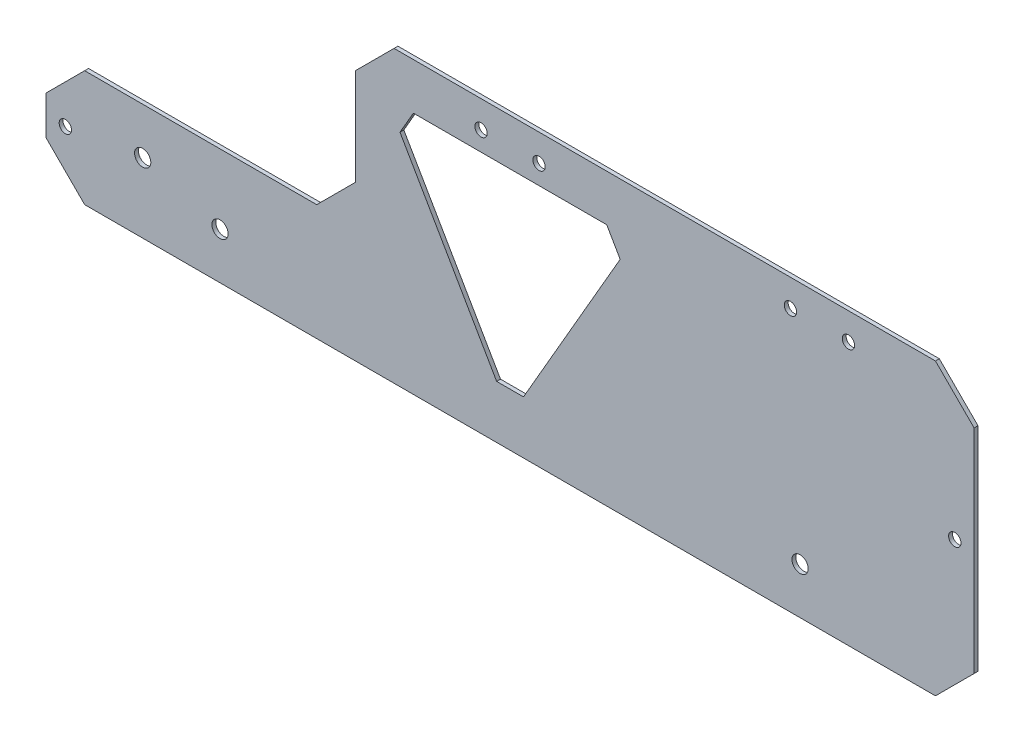
ISO-10303-21;
HEADER;
FILE_DESCRIPTION(('STEP AP214'),'2;1');
FILE_NAME('part.step','',(''),(''),'','','');
FILE_SCHEMA(('AUTOMOTIVE_DESIGN { 1 0 10303 214 1 1 1 1 }'));
ENDSEC;
DATA;
#1=APPLICATION_CONTEXT('core data for automotive mechanical design processes');
#2=APPLICATION_PROTOCOL_DEFINITION('international standard','automotive_design',2000,#1);
#3=PRODUCT_CONTEXT('',#1,'mechanical');
#4=PRODUCT('Part','Part','',(#3));
#5=PRODUCT_RELATED_PRODUCT_CATEGORY('part','',(#4));
#6=PRODUCT_DEFINITION_FORMATION('','',#4);
#7=PRODUCT_DEFINITION_CONTEXT('part definition',#1,'design');
#8=PRODUCT_DEFINITION('design','',#6,#7);
#9=PRODUCT_DEFINITION_SHAPE('','',#8);
#10=(LENGTH_UNIT() NAMED_UNIT(*) SI_UNIT(.MILLI.,.METRE.));
#11=(NAMED_UNIT(*) PLANE_ANGLE_UNIT() SI_UNIT($,.RADIAN.));
#12=(NAMED_UNIT(*) SI_UNIT($,.STERADIAN.) SOLID_ANGLE_UNIT());
#13=UNCERTAINTY_MEASURE_WITH_UNIT(LENGTH_MEASURE(1.E-05),#10,'distance_accuracy_value','');
#14=(GEOMETRIC_REPRESENTATION_CONTEXT(3) GLOBAL_UNCERTAINTY_ASSIGNED_CONTEXT((#13)) GLOBAL_UNIT_ASSIGNED_CONTEXT((#10,
#11,#12)) REPRESENTATION_CONTEXT('',''));
#15=CARTESIAN_POINT('',(0.,0.,0.));
#16=DIRECTION('',(0.,0.,1.));
#17=DIRECTION('',(1.,0.,0.));
#18=AXIS2_PLACEMENT_3D('',#15,#16,#17);
#19=CARTESIAN_POINT('',(0.,0.,1.));
#20=DIRECTION('',(1.,0.,0.));
#21=DIRECTION('',(0.,0.,-1.));
#22=AXIS2_PLACEMENT_3D('',#19,#20,#21);
#23=PLANE('',#22);
#24=DIRECTION('',(0.,-1.,0.));
#25=VECTOR('',#24,1.);
#26=CARTESIAN_POINT('',(0.,0.,0.));
#27=LINE('',#26,#25);
#28=CARTESIAN_POINT('',(0.,20.,0.));
#29=VERTEX_POINT('',#28);
#30=CARTESIAN_POINT('',(0.,10.,0.));
#31=VERTEX_POINT('',#30);
#32=EDGE_CURVE('E343',#29,#31,#27,.T.);
#33=ORIENTED_EDGE('',*,*,#32,.T.);
#34=DIRECTION('',(0.,0.,1.));
#35=VECTOR('',#34,1.);
#36=CARTESIAN_POINT('',(0.,10.,1.));
#37=LINE('',#36,#35);
#38=CARTESIAN_POINT('',(0.,10.,1.));
#39=VERTEX_POINT('',#38);
#40=EDGE_CURVE('E433',#31,#39,#37,.T.);
#41=ORIENTED_EDGE('',*,*,#40,.T.);
#42=DIRECTION('',(0.,-1.,0.));
#43=VECTOR('',#42,1.);
#44=CARTESIAN_POINT('',(0.,0.,1.));
#45=LINE('',#44,#43);
#46=CARTESIAN_POINT('',(0.,20.,1.));
#47=VERTEX_POINT('',#46);
#48=EDGE_CURVE('E348',#47,#39,#45,.T.);
#49=ORIENTED_EDGE('',*,*,#48,.F.);
#50=DIRECTION('',(0.,0.,-1.));
#51=VECTOR('',#50,1.);
#52=CARTESIAN_POINT('',(0.,20.,1.));
#53=LINE('',#52,#51);
#54=EDGE_CURVE('E429',#47,#29,#53,.T.);
#55=ORIENTED_EDGE('',*,*,#54,.T.);
#56=EDGE_LOOP('',(#33,#41,#49,#55));
#57=FACE_BOUND('',#56,.T.);
#58=ADVANCED_FACE('F51',(#57),#23,.F.);
#59=CARTESIAN_POINT('',(0.,0.,1.));
#60=DIRECTION('',(0.,1.,0.));
#61=DIRECTION('',(-1.,0.,0.));
#62=AXIS2_PLACEMENT_3D('',#59,#60,#61);
#63=PLANE('',#62);
#64=DIRECTION('',(1.,0.,0.));
#65=VECTOR('',#64,1.);
#66=CARTESIAN_POINT('',(0.,0.,1.));
#67=LINE('',#66,#65);
#68=CARTESIAN_POINT('',(10.,0.,1.));
#69=VERTEX_POINT('',#68);
#70=CARTESIAN_POINT('',(230.,0.,1.));
#71=VERTEX_POINT('',#70);
#72=EDGE_CURVE('E346',#69,#71,#67,.T.);
#73=ORIENTED_EDGE('',*,*,#72,.F.);
#74=DIRECTION('',(0.,0.,-1.));
#75=VECTOR('',#74,1.);
#76=CARTESIAN_POINT('',(10.,0.,1.));
#77=LINE('',#76,#75);
#78=CARTESIAN_POINT('',(10.,0.,0.));
#79=VERTEX_POINT('',#78);
#80=EDGE_CURVE('E424',#69,#79,#77,.T.);
#81=ORIENTED_EDGE('',*,*,#80,.T.);
#82=DIRECTION('',(1.,0.,0.));
#83=VECTOR('',#82,1.);
#84=CARTESIAN_POINT('',(0.,0.,0.));
#85=LINE('',#84,#83);
#86=CARTESIAN_POINT('',(230.,0.,0.));
#87=VERTEX_POINT('',#86);
#88=EDGE_CURVE('E362',#79,#87,#85,.T.);
#89=ORIENTED_EDGE('',*,*,#88,.T.);
#90=DIRECTION('',(0.,0.,1.));
#91=VECTOR('',#90,1.);
#92=CARTESIAN_POINT('',(230.,0.,1.));
#93=LINE('',#92,#91);
#94=EDGE_CURVE('E422',#87,#71,#93,.T.);
#95=ORIENTED_EDGE('',*,*,#94,.T.);
#96=EDGE_LOOP('',(#73,#81,#89,#95));
#97=FACE_BOUND('',#96,.T.);
#98=ADVANCED_FACE('F473',(#97),#63,.F.);
#99=CARTESIAN_POINT('',(240.,0.,1.));
#100=DIRECTION('',(-1.,0.,0.));
#101=DIRECTION('',(0.,-1.,0.));
#102=AXIS2_PLACEMENT_3D('',#99,#100,#101);
#103=PLANE('',#102);
#104=DIRECTION('',(0.,1.,0.));
#105=VECTOR('',#104,1.);
#106=CARTESIAN_POINT('',(240.,0.,0.));
#107=LINE('',#106,#105);
#108=CARTESIAN_POINT('',(240.,10.0000000000001,0.));
#109=VERTEX_POINT('',#108);
#110=CARTESIAN_POINT('',(240.,65.,0.));
#111=VERTEX_POINT('',#110);
#112=EDGE_CURVE('E368',#109,#111,#107,.T.);
#113=ORIENTED_EDGE('',*,*,#112,.T.);
#114=DIRECTION('',(0.,0.,1.));
#115=VECTOR('',#114,1.);
#116=CARTESIAN_POINT('',(240.,65.,1.));
#117=LINE('',#116,#115);
#118=CARTESIAN_POINT('',(240.,65.,1.));
#119=VERTEX_POINT('',#118);
#120=EDGE_CURVE('E67',#111,#119,#117,.T.);
#121=ORIENTED_EDGE('',*,*,#120,.T.);
#122=DIRECTION('',(0.,1.,0.));
#123=VECTOR('',#122,1.);
#124=CARTESIAN_POINT('',(240.,0.,1.));
#125=LINE('',#124,#123);
#126=CARTESIAN_POINT('',(240.,10.0000000000001,1.));
#127=VERTEX_POINT('',#126);
#128=EDGE_CURVE('E352',#127,#119,#125,.T.);
#129=ORIENTED_EDGE('',*,*,#128,.F.);
#130=DIRECTION('',(0.,0.,-1.));
#131=VECTOR('',#130,1.);
#132=CARTESIAN_POINT('',(240.,10.0000000000001,1.));
#133=LINE('',#132,#131);
#134=EDGE_CURVE('E416',#127,#109,#133,.T.);
#135=ORIENTED_EDGE('',*,*,#134,.T.);
#136=EDGE_LOOP('',(#113,#121,#129,#135));
#137=FACE_BOUND('',#136,.T.);
#138=ADVANCED_FACE('F481',(#137),#103,.F.);
#139=CARTESIAN_POINT('',(0.,75.,1.));
#140=DIRECTION('',(0.,-1.,0.));
#141=DIRECTION('',(1.,0.,0.));
#142=AXIS2_PLACEMENT_3D('',#139,#140,#141);
#143=PLANE('',#142);
#144=DIRECTION('',(-1.,0.,0.));
#145=VECTOR('',#144,1.);
#146=CARTESIAN_POINT('',(0.,75.,0.));
#147=LINE('',#146,#145);
#148=CARTESIAN_POINT('',(230.,75.,0.));
#149=VERTEX_POINT('',#148);
#150=CARTESIAN_POINT('',(90.,75.,0.));
#151=VERTEX_POINT('',#150);
#152=EDGE_CURVE('E351',#149,#151,#147,.T.);
#153=ORIENTED_EDGE('',*,*,#152,.T.);
#154=DIRECTION('',(0.,0.,1.));
#155=VECTOR('',#154,1.);
#156=CARTESIAN_POINT('',(90.,75.,1.));
#157=LINE('',#156,#155);
#158=CARTESIAN_POINT('',(90.,75.,1.));
#159=VERTEX_POINT('',#158);
#160=EDGE_CURVE('E397',#151,#159,#157,.T.);
#161=ORIENTED_EDGE('',*,*,#160,.T.);
#162=DIRECTION('',(-1.,0.,0.));
#163=VECTOR('',#162,1.);
#164=CARTESIAN_POINT('',(0.,75.,1.));
#165=LINE('',#164,#163);
#166=CARTESIAN_POINT('',(230.,75.,1.));
#167=VERTEX_POINT('',#166);
#168=EDGE_CURVE('E357',#167,#159,#165,.T.);
#169=ORIENTED_EDGE('',*,*,#168,.F.);
#170=DIRECTION('',(0.,0.,-1.));
#171=VECTOR('',#170,1.);
#172=CARTESIAN_POINT('',(230.,75.,1.));
#173=LINE('',#172,#171);
#174=EDGE_CURVE('E391',#167,#149,#173,.T.);
#175=ORIENTED_EDGE('',*,*,#174,.T.);
#176=EDGE_LOOP('',(#153,#161,#169,#175));
#177=FACE_BOUND('',#176,.T.);
#178=ADVANCED_FACE('F490',(#177),#143,.F.);
#179=CARTESIAN_POINT('',(0.,0.,1.));
#180=DIRECTION('',(0.,0.,-1.));
#181=DIRECTION('',(-1.,0.,0.));
#182=AXIS2_PLACEMENT_3D('',#179,#180,#181);
#183=PLANE('',#182);
#184=DIRECTION('',(1.,0.,0.));
#185=VECTOR('',#184,1.);
#186=CARTESIAN_POINT('',(123.469655114603,13.6891108675447,1.));
#187=LINE('',#186,#185);
#188=CARTESIAN_POINT('',(116.530344885397,13.6891108675447,1.));
#189=VERTEX_POINT('',#188);
#190=CARTESIAN_POINT('',(123.469655114603,13.6891108675447,1.));
#191=VERTEX_POINT('',#190);
#192=EDGE_CURVE('E197',#189,#191,#187,.T.);
#193=ORIENTED_EDGE('',*,*,#192,.F.);
#194=DIRECTION('',(-0.500000000000001,0.866025403784438,0.));
#195=VECTOR('',#194,1.);
#196=CARTESIAN_POINT('',(93.3253175473054,53.8813972081442,1.));
#197=LINE('',#196,#195);
#198=CARTESIAN_POINT('',(91.5303448853971,56.9903810567666,0.999999999999999));
#199=VERTEX_POINT('',#198);
#200=EDGE_CURVE('E179',#189,#199,#197,.T.);
#201=ORIENTED_EDGE('',*,*,#200,.T.);
#202=DIRECTION('',(0.500000000000002,0.866025403784437,0.));
#203=VECTOR('',#202,1.);
#204=CARTESIAN_POINT('',(43.9701997807898,-25.3862066797608,1.));
#205=LINE('',#204,#203);
#206=CARTESIAN_POINT('',(95.,63.,0.999999999999999));
#207=VERTEX_POINT('',#206);
#208=EDGE_CURVE('E192',#199,#207,#205,.T.);
#209=ORIENTED_EDGE('',*,*,#208,.T.);
#210=DIRECTION('',(-1.,0.,0.));
#211=VECTOR('',#210,1.);
#212=CARTESIAN_POINT('',(0.,63.,1.));
#213=LINE('',#212,#211);
#214=CARTESIAN_POINT('',(145.,63.,0.999999999999999));
#215=VERTEX_POINT('',#214);
#216=EDGE_CURVE('E340',#215,#207,#213,.T.);
#217=ORIENTED_EDGE('',*,*,#216,.F.);
#218=DIRECTION('',(-0.500000000000002,0.866025403784437,0.));
#219=VECTOR('',#218,1.);
#220=CARTESIAN_POINT('',(136.02980021921,78.5368417743721,1.));
#221=LINE('',#220,#219);
#222=CARTESIAN_POINT('',(148.469655114603,56.9903810567666,0.999999999999999));
#223=VERTEX_POINT('',#222);
#224=EDGE_CURVE('E338',#223,#215,#221,.T.);
#225=ORIENTED_EDGE('',*,*,#224,.F.);
#226=DIRECTION('',(0.500000000000001,0.866025403784438,0.));
#227=VECTOR('',#226,1.);
#228=CARTESIAN_POINT('',(86.6746824526944,-50.0416512459885,1.));
#229=LINE('',#228,#227);
#230=EDGE_CURVE('E210',#191,#223,#229,.T.);
#231=ORIENTED_EDGE('',*,*,#230,.F.);
#232=EDGE_LOOP('',(#193,#201,#209,#217,#225,#231));
#233=FACE_BOUND('',#232,.T.);
#234=CARTESIAN_POINT('',(5.,15.,0.999999999999999));
#235=DIRECTION('',(0.,0.,-1.));
#236=DIRECTION('',(-1.,0.,0.));
#237=AXIS2_PLACEMENT_3D('',#234,#235,#236);
#238=CIRCLE('',#237,1.6);
#239=CARTESIAN_POINT('',(3.4,15.,0.999999999999999));
#240=VERTEX_POINT('',#239);
#241=EDGE_CURVE('E290',#240,#240,#238,.T.);
#242=ORIENTED_EDGE('',*,*,#241,.T.);
#243=EDGE_LOOP('',(#242));
#244=FACE_BOUND('',#243,.T.);
#245=CARTESIAN_POINT('',(25.,17.9999999999984,0.999999999999999));
#246=DIRECTION('',(0.,0.,-1.));
#247=DIRECTION('',(-1.,0.,0.));
#248=AXIS2_PLACEMENT_3D('',#245,#246,#247);
#249=CIRCLE('',#248,2.1);
#250=CARTESIAN_POINT('',(22.9,17.9999999999984,0.999999999999999));
#251=VERTEX_POINT('',#250);
#252=EDGE_CURVE('E282',#251,#251,#249,.T.);
#253=ORIENTED_EDGE('',*,*,#252,.T.);
#254=EDGE_LOOP('',(#253));
#255=FACE_BOUND('',#254,.T.);
#256=CARTESIAN_POINT('',(112.5,68.,0.999999999999999));
#257=DIRECTION('',(0.,0.,-1.));
#258=DIRECTION('',(-1.,0.,0.));
#259=AXIS2_PLACEMENT_3D('',#256,#257,#258);
#260=CIRCLE('',#259,1.59999999999999);
#261=CARTESIAN_POINT('',(110.9,68.,0.999999999999999));
#262=VERTEX_POINT('',#261);
#263=EDGE_CURVE('E276',#262,#262,#260,.T.);
#264=ORIENTED_EDGE('',*,*,#263,.T.);
#265=EDGE_LOOP('',(#264));
#266=FACE_BOUND('',#265,.T.);
#267=CARTESIAN_POINT('',(127.5,68.,0.999999999999999));
#268=DIRECTION('',(0.,0.,-1.));
#269=DIRECTION('',(-1.,0.,0.));
#270=AXIS2_PLACEMENT_3D('',#267,#268,#269);
#271=CIRCLE('',#270,1.59999999999999);
#272=CARTESIAN_POINT('',(125.9,68.,0.999999999999999));
#273=VERTEX_POINT('',#272);
#274=EDGE_CURVE('E273',#273,#273,#271,.T.);
#275=ORIENTED_EDGE('',*,*,#274,.T.);
#276=EDGE_LOOP('',(#275));
#277=FACE_BOUND('',#276,.T.);
#278=CARTESIAN_POINT('',(192.5,68.,0.999999999999999));
#279=DIRECTION('',(0.,0.,-1.));
#280=DIRECTION('',(-1.,0.,0.));
#281=AXIS2_PLACEMENT_3D('',#278,#279,#280);
#282=CIRCLE('',#281,1.59999999999999);
#283=CARTESIAN_POINT('',(190.9,68.,0.999999999999999));
#284=VERTEX_POINT('',#283);
#285=EDGE_CURVE('E272',#284,#284,#282,.T.);
#286=ORIENTED_EDGE('',*,*,#285,.T.);
#287=EDGE_LOOP('',(#286));
#288=FACE_BOUND('',#287,.T.);
#289=CARTESIAN_POINT('',(207.5,68.,0.999999999999999));
#290=DIRECTION('',(0.,0.,-1.));
#291=DIRECTION('',(-1.,0.,0.));
#292=AXIS2_PLACEMENT_3D('',#289,#290,#291);
#293=CIRCLE('',#292,1.59999999999999);
#294=CARTESIAN_POINT('',(205.9,68.,0.999999999999999));
#295=VERTEX_POINT('',#294);
#296=EDGE_CURVE('E270',#295,#295,#293,.T.);
#297=ORIENTED_EDGE('',*,*,#296,.T.);
#298=EDGE_LOOP('',(#297));
#299=FACE_BOUND('',#298,.T.);
#300=CARTESIAN_POINT('',(235.,37.5,0.999999999999999));
#301=DIRECTION('',(0.,0.,-1.));
#302=DIRECTION('',(-1.,0.,0.));
#303=AXIS2_PLACEMENT_3D('',#300,#301,#302);
#304=CIRCLE('',#303,1.59999999999999);
#305=CARTESIAN_POINT('',(233.4,37.5,0.999999999999999));
#306=VERTEX_POINT('',#305);
#307=EDGE_CURVE('E262',#306,#306,#304,.T.);
#308=ORIENTED_EDGE('',*,*,#307,.T.);
#309=EDGE_LOOP('',(#308));
#310=FACE_BOUND('',#309,.T.);
#311=CARTESIAN_POINT('',(45.,12.,0.999999999999999));
#312=DIRECTION('',(0.,0.,-1.));
#313=DIRECTION('',(-1.,0.,0.));
#314=AXIS2_PLACEMENT_3D('',#311,#312,#313);
#315=CIRCLE('',#314,2.1);
#316=CARTESIAN_POINT('',(42.9,12.,0.999999999999999));
#317=VERTEX_POINT('',#316);
#318=EDGE_CURVE('E256',#317,#317,#315,.T.);
#319=ORIENTED_EDGE('',*,*,#318,.T.);
#320=EDGE_LOOP('',(#319));
#321=FACE_BOUND('',#320,.T.);
#322=CARTESIAN_POINT('',(195.,12.,0.999999999999999));
#323=DIRECTION('',(0.,0.,-1.));
#324=DIRECTION('',(-1.,0.,0.));
#325=AXIS2_PLACEMENT_3D('',#322,#323,#324);
#326=CIRCLE('',#325,2.09999999999999);
#327=CARTESIAN_POINT('',(192.9,12.,0.999999999999999));
#328=VERTEX_POINT('',#327);
#329=EDGE_CURVE('E222',#328,#328,#326,.T.);
#330=ORIENTED_EDGE('',*,*,#329,.T.);
#331=EDGE_LOOP('',(#330));
#332=FACE_BOUND('',#331,.T.);
#333=ORIENTED_EDGE('',*,*,#168,.T.);
#334=DIRECTION('',(0.707106781186548,0.707106781186548,0.));
#335=VECTOR('',#334,1.);
#336=CARTESIAN_POINT('',(80.,65.,0.999999999999999));
#337=LINE('',#336,#335);
#338=CARTESIAN_POINT('',(80.,65.,1.));
#339=VERTEX_POINT('',#338);
#340=EDGE_CURVE('E412',#159,#339,#337,.F.);
#341=ORIENTED_EDGE('',*,*,#340,.T.);
#342=DIRECTION('',(0.,-1.,0.));
#343=VECTOR('',#342,1.);
#344=CARTESIAN_POINT('',(80.,0.,1.));
#345=LINE('',#344,#343);
#346=CARTESIAN_POINT('',(80.,40.,1.));
#347=VERTEX_POINT('',#346);
#348=EDGE_CURVE('E299',#339,#347,#345,.T.);
#349=ORIENTED_EDGE('',*,*,#348,.T.);
#350=DIRECTION('',(0.707106781186551,0.707106781186544,0.));
#351=VECTOR('',#350,1.);
#352=CARTESIAN_POINT('',(19.9999999999996,-19.9999999999998,1.));
#353=LINE('',#352,#351);
#354=CARTESIAN_POINT('',(69.9999999999999,30.,1.));
#355=VERTEX_POINT('',#354);
#356=EDGE_CURVE('E11',#347,#355,#353,.F.);
#357=ORIENTED_EDGE('',*,*,#356,.T.);
#358=DIRECTION('',(-1.,0.,0.));
#359=VECTOR('',#358,1.);
#360=CARTESIAN_POINT('',(0.,30.,1.));
#361=LINE('',#360,#359);
#362=CARTESIAN_POINT('',(10.,30.,1.));
#363=VERTEX_POINT('',#362);
#364=EDGE_CURVE('E303',#355,#363,#361,.T.);
#365=ORIENTED_EDGE('',*,*,#364,.T.);
#366=DIRECTION('',(0.707106781186548,0.707106781186548,0.));
#367=VECTOR('',#366,1.);
#368=CARTESIAN_POINT('',(0.,20.,1.));
#369=LINE('',#368,#367);
#370=EDGE_CURVE('E404',#363,#47,#369,.F.);
#371=ORIENTED_EDGE('',*,*,#370,.T.);
#372=ORIENTED_EDGE('',*,*,#48,.T.);
#373=DIRECTION('',(-0.707106781186548,0.707106781186548,0.));
#374=VECTOR('',#373,1.);
#375=CARTESIAN_POINT('',(10.,0.,1.));
#376=LINE('',#375,#374);
#377=EDGE_CURVE('E410',#39,#69,#376,.F.);
#378=ORIENTED_EDGE('',*,*,#377,.T.);
#379=ORIENTED_EDGE('',*,*,#72,.T.);
#380=DIRECTION('',(-0.707106781186548,-0.707106781186548,0.));
#381=VECTOR('',#380,1.);
#382=CARTESIAN_POINT('',(240.,10.0000000000001,1.));
#383=LINE('',#382,#381);
#384=EDGE_CURVE('E74',#71,#127,#383,.F.);
#385=ORIENTED_EDGE('',*,*,#384,.T.);
#386=ORIENTED_EDGE('',*,*,#128,.T.);
#387=DIRECTION('',(0.707106781186548,-0.707106781186548,0.));
#388=VECTOR('',#387,1.);
#389=CARTESIAN_POINT('',(230.,75.,1.));
#390=LINE('',#389,#388);
#391=EDGE_CURVE('E408',#119,#167,#390,.F.);
#392=ORIENTED_EDGE('',*,*,#391,.T.);
#393=EDGE_LOOP('',(#333,#341,#349,#357,#365,#371,#372,#378,#379,#385,#386,#392));
#394=FACE_BOUND('',#393,.T.);
#395=ADVANCED_FACE('F202',(#233,#244,#255,#266,#277,#288,#299,#310,#321,#332,#394),#183,.F.);
#396=CARTESIAN_POINT('',(0.,0.,0.));
#397=DIRECTION('',(0.,0.,-1.));
#398=DIRECTION('',(-1.,0.,0.));
#399=AXIS2_PLACEMENT_3D('',#396,#397,#398);
#400=PLANE('',#399);
#401=DIRECTION('',(-0.500000000000001,0.866025403784438,0.));
#402=VECTOR('',#401,1.);
#403=CARTESIAN_POINT('',(93.3253175473054,53.8813972081441,0.));
#404=LINE('',#403,#402);
#405=CARTESIAN_POINT('',(116.530344885397,13.6891108675447,0.));
#406=VERTEX_POINT('',#405);
#407=CARTESIAN_POINT('',(91.5303448853971,56.9903810567666,0.));
#408=VERTEX_POINT('',#407);
#409=EDGE_CURVE('E310',#406,#408,#404,.T.);
#410=ORIENTED_EDGE('',*,*,#409,.F.);
#411=DIRECTION('',(1.,0.,0.));
#412=VECTOR('',#411,1.);
#413=CARTESIAN_POINT('',(123.469655114603,13.6891108675447,0.));
#414=LINE('',#413,#412);
#415=CARTESIAN_POINT('',(123.469655114603,13.6891108675447,0.));
#416=VERTEX_POINT('',#415);
#417=EDGE_CURVE('E196',#406,#416,#414,.T.);
#418=ORIENTED_EDGE('',*,*,#417,.T.);
#419=DIRECTION('',(0.500000000000001,0.866025403784438,0.));
#420=VECTOR('',#419,1.);
#421=CARTESIAN_POINT('',(86.6746824526944,-50.0416512459885,0.));
#422=LINE('',#421,#420);
#423=CARTESIAN_POINT('',(148.469655114603,56.9903810567666,0.));
#424=VERTEX_POINT('',#423);
#425=EDGE_CURVE('E322',#416,#424,#422,.T.);
#426=ORIENTED_EDGE('',*,*,#425,.T.);
#427=DIRECTION('',(-0.500000000000002,0.866025403784437,0.));
#428=VECTOR('',#427,1.);
#429=CARTESIAN_POINT('',(136.02980021921,78.5368417743721,0.));
#430=LINE('',#429,#428);
#431=CARTESIAN_POINT('',(145.,63.,0.));
#432=VERTEX_POINT('',#431);
#433=EDGE_CURVE('E320',#424,#432,#430,.T.);
#434=ORIENTED_EDGE('',*,*,#433,.T.);
#435=DIRECTION('',(-1.,0.,0.));
#436=VECTOR('',#435,1.);
#437=CARTESIAN_POINT('',(0.,63.,0.));
#438=LINE('',#437,#436);
#439=CARTESIAN_POINT('',(95.,63.,0.));
#440=VERTEX_POINT('',#439);
#441=EDGE_CURVE('E312',#432,#440,#438,.T.);
#442=ORIENTED_EDGE('',*,*,#441,.T.);
#443=DIRECTION('',(0.500000000000002,0.866025403784437,0.));
#444=VECTOR('',#443,1.);
#445=CARTESIAN_POINT('',(43.9701997807898,-25.3862066797608,0.));
#446=LINE('',#445,#444);
#447=EDGE_CURVE('E309',#408,#440,#446,.T.);
#448=ORIENTED_EDGE('',*,*,#447,.F.);
#449=EDGE_LOOP('',(#410,#418,#426,#434,#442,#448));
#450=FACE_BOUND('',#449,.T.);
#451=CARTESIAN_POINT('',(5.,15.,0.));
#452=DIRECTION('',(0.,0.,-1.));
#453=DIRECTION('',(-1.,0.,0.));
#454=AXIS2_PLACEMENT_3D('',#451,#452,#453);
#455=CIRCLE('',#454,1.6);
#456=CARTESIAN_POINT('',(3.4,15.,0.));
#457=VERTEX_POINT('',#456);
#458=EDGE_CURVE('E216',#457,#457,#455,.T.);
#459=ORIENTED_EDGE('',*,*,#458,.F.);
#460=EDGE_LOOP('',(#459));
#461=FACE_BOUND('',#460,.T.);
#462=CARTESIAN_POINT('',(25.,17.9999999999984,0.));
#463=DIRECTION('',(0.,0.,-1.));
#464=DIRECTION('',(-1.,0.,0.));
#465=AXIS2_PLACEMENT_3D('',#462,#463,#464);
#466=CIRCLE('',#465,2.1);
#467=CARTESIAN_POINT('',(22.9,17.9999999999984,0.));
#468=VERTEX_POINT('',#467);
#469=EDGE_CURVE('E217',#468,#468,#466,.T.);
#470=ORIENTED_EDGE('',*,*,#469,.F.);
#471=EDGE_LOOP('',(#470));
#472=FACE_BOUND('',#471,.T.);
#473=CARTESIAN_POINT('',(112.5,68.,0.));
#474=DIRECTION('',(0.,0.,-1.));
#475=DIRECTION('',(1.,0.,0.));
#476=AXIS2_PLACEMENT_3D('',#473,#474,#475);
#477=CIRCLE('',#476,1.59999999999999);
#478=CARTESIAN_POINT('',(114.1,68.,0.));
#479=VERTEX_POINT('',#478);
#480=EDGE_CURVE('E232',#479,#479,#477,.T.);
#481=ORIENTED_EDGE('',*,*,#480,.F.);
#482=EDGE_LOOP('',(#481));
#483=FACE_BOUND('',#482,.T.);
#484=CARTESIAN_POINT('',(127.5,68.,0.));
#485=DIRECTION('',(0.,0.,-1.));
#486=DIRECTION('',(1.,0.,0.));
#487=AXIS2_PLACEMENT_3D('',#484,#485,#486);
#488=CIRCLE('',#487,1.59999999999999);
#489=CARTESIAN_POINT('',(129.1,68.,0.));
#490=VERTEX_POINT('',#489);
#491=EDGE_CURVE('E233',#490,#490,#488,.T.);
#492=ORIENTED_EDGE('',*,*,#491,.F.);
#493=EDGE_LOOP('',(#492));
#494=FACE_BOUND('',#493,.T.);
#495=CARTESIAN_POINT('',(192.5,68.,0.));
#496=DIRECTION('',(0.,0.,-1.));
#497=DIRECTION('',(-1.,0.,0.));
#498=AXIS2_PLACEMENT_3D('',#495,#496,#497);
#499=CIRCLE('',#498,1.59999999999999);
#500=CARTESIAN_POINT('',(190.9,68.,0.));
#501=VERTEX_POINT('',#500);
#502=EDGE_CURVE('E228',#501,#501,#499,.T.);
#503=ORIENTED_EDGE('',*,*,#502,.F.);
#504=EDGE_LOOP('',(#503));
#505=FACE_BOUND('',#504,.T.);
#506=CARTESIAN_POINT('',(207.5,68.,0.));
#507=DIRECTION('',(0.,0.,-1.));
#508=DIRECTION('',(-1.,0.,0.));
#509=AXIS2_PLACEMENT_3D('',#506,#507,#508);
#510=CIRCLE('',#509,1.59999999999999);
#511=CARTESIAN_POINT('',(205.9,68.,0.));
#512=VERTEX_POINT('',#511);
#513=EDGE_CURVE('E229',#512,#512,#510,.T.);
#514=ORIENTED_EDGE('',*,*,#513,.F.);
#515=EDGE_LOOP('',(#514));
#516=FACE_BOUND('',#515,.T.);
#517=CARTESIAN_POINT('',(235.,37.5,0.));
#518=DIRECTION('',(0.,0.,-1.));
#519=DIRECTION('',(-1.,0.,0.));
#520=AXIS2_PLACEMENT_3D('',#517,#518,#519);
#521=CIRCLE('',#520,1.59999999999999);
#522=CARTESIAN_POINT('',(233.4,37.5,0.));
#523=VERTEX_POINT('',#522);
#524=EDGE_CURVE('E248',#523,#523,#521,.T.);
#525=ORIENTED_EDGE('',*,*,#524,.F.);
#526=EDGE_LOOP('',(#525));
#527=FACE_BOUND('',#526,.T.);
#528=CARTESIAN_POINT('',(45.,12.,0.));
#529=DIRECTION('',(0.,0.,-1.));
#530=DIRECTION('',(-1.,0.,0.));
#531=AXIS2_PLACEMENT_3D('',#528,#529,#530);
#532=CIRCLE('',#531,2.1);
#533=CARTESIAN_POINT('',(42.9,12.,0.));
#534=VERTEX_POINT('',#533);
#535=EDGE_CURVE('E244',#534,#534,#532,.T.);
#536=ORIENTED_EDGE('',*,*,#535,.F.);
#537=EDGE_LOOP('',(#536));
#538=FACE_BOUND('',#537,.T.);
#539=CARTESIAN_POINT('',(195.,12.,0.));
#540=DIRECTION('',(0.,0.,-1.));
#541=DIRECTION('',(-1.,0.,0.));
#542=AXIS2_PLACEMENT_3D('',#539,#540,#541);
#543=CIRCLE('',#542,2.09999999999999);
#544=CARTESIAN_POINT('',(192.9,12.,0.));
#545=VERTEX_POINT('',#544);
#546=EDGE_CURVE('E224',#545,#545,#543,.T.);
#547=ORIENTED_EDGE('',*,*,#546,.F.);
#548=EDGE_LOOP('',(#547));
#549=FACE_BOUND('',#548,.T.);
#550=DIRECTION('',(0.,-1.,0.));
#551=VECTOR('',#550,1.);
#552=CARTESIAN_POINT('',(80.,75.,0.));
#553=LINE('',#552,#551);
#554=CARTESIAN_POINT('',(80.,65.,0.));
#555=VERTEX_POINT('',#554);
#556=CARTESIAN_POINT('',(80.,40.,0.));
#557=VERTEX_POINT('',#556);
#558=EDGE_CURVE('E293',#555,#557,#553,.T.);
#559=ORIENTED_EDGE('',*,*,#558,.F.);
#560=DIRECTION('',(-0.707106781186548,-0.707106781186548,0.));
#561=VECTOR('',#560,1.);
#562=CARTESIAN_POINT('',(7.50000000000001,-7.50000000000001,0.));
#563=LINE('',#562,#561);
#564=EDGE_CURVE('E394',#555,#151,#563,.F.);
#565=ORIENTED_EDGE('',*,*,#564,.T.);
#566=ORIENTED_EDGE('',*,*,#152,.F.);
#567=DIRECTION('',(-0.707106781186548,0.707106781186548,0.));
#568=VECTOR('',#567,1.);
#569=CARTESIAN_POINT('',(152.5,152.5,0.));
#570=LINE('',#569,#568);
#571=EDGE_CURVE('E386',#149,#111,#570,.F.);
#572=ORIENTED_EDGE('',*,*,#571,.T.);
#573=ORIENTED_EDGE('',*,*,#112,.F.);
#574=DIRECTION('',(0.707106781186548,0.707106781186548,0.));
#575=VECTOR('',#574,1.);
#576=CARTESIAN_POINT('',(115.,-115.,0.));
#577=LINE('',#576,#575);
#578=EDGE_CURVE('E379',#109,#87,#577,.F.);
#579=ORIENTED_EDGE('',*,*,#578,.T.);
#580=ORIENTED_EDGE('',*,*,#88,.F.);
#581=DIRECTION('',(0.707106781186548,-0.707106781186548,0.));
#582=VECTOR('',#581,1.);
#583=CARTESIAN_POINT('',(5.00000000000002,5.00000000000002,0.));
#584=LINE('',#583,#582);
#585=EDGE_CURVE('E387',#79,#31,#584,.F.);
#586=ORIENTED_EDGE('',*,*,#585,.T.);
#587=ORIENTED_EDGE('',*,*,#32,.F.);
#588=DIRECTION('',(-0.707106781186548,-0.707106781186548,0.));
#589=VECTOR('',#588,1.);
#590=CARTESIAN_POINT('',(-9.99999999999999,9.99999999999999,0.));
#591=LINE('',#590,#589);
#592=CARTESIAN_POINT('',(10.,30.,0.));
#593=VERTEX_POINT('',#592);
#594=EDGE_CURVE('E384',#29,#593,#591,.F.);
#595=ORIENTED_EDGE('',*,*,#594,.T.);
#596=DIRECTION('',(-1.,0.,0.));
#597=VECTOR('',#596,1.);
#598=CARTESIAN_POINT('',(80.,30.,0.));
#599=LINE('',#598,#597);
#600=CARTESIAN_POINT('',(69.9999999999999,30.,0.));
#601=VERTEX_POINT('',#600);
#602=EDGE_CURVE('E294',#601,#593,#599,.T.);
#603=ORIENTED_EDGE('',*,*,#602,.F.);
#604=DIRECTION('',(-0.707106781186551,-0.707106781186544,0.));
#605=VECTOR('',#604,1.);
#606=CARTESIAN_POINT('',(69.9999999999999,30.,0.));
#607=LINE('',#606,#605);
#608=EDGE_CURVE('E62',#601,#557,#607,.F.);
#609=ORIENTED_EDGE('',*,*,#608,.T.);
#610=EDGE_LOOP('',(#559,#565,#566,#572,#573,#579,#580,#586,#587,#595,#603,#609));
#611=FACE_BOUND('',#610,.T.);
#612=ADVANCED_FACE('F450',(#450,#461,#472,#483,#494,#505,#516,#527,#538,#549,#611),#400,.T.);
#613=CARTESIAN_POINT('',(86.6746824526944,-50.0416512459885,9.99999999999997));
#614=DIRECTION('',(-0.866025403784438,0.500000000000001,0.));
#615=DIRECTION('',(-0.500000000000001,-0.866025403784438,0.));
#616=AXIS2_PLACEMENT_3D('',#613,#614,#615);
#617=PLANE('',#616);
#618=ORIENTED_EDGE('',*,*,#230,.T.);
#619=DIRECTION('',(0.,0.,-1.));
#620=VECTOR('',#619,1.);
#621=CARTESIAN_POINT('',(148.469655114603,56.9903810567666,10.));
#622=LINE('',#621,#620);
#623=EDGE_CURVE('E195',#223,#424,#622,.T.);
#624=ORIENTED_EDGE('',*,*,#623,.T.);
#625=ORIENTED_EDGE('',*,*,#425,.F.);
#626=DIRECTION('',(0.,0.,-1.));
#627=VECTOR('',#626,1.);
#628=CARTESIAN_POINT('',(123.469655114603,13.6891108675447,1.));
#629=LINE('',#628,#627);
#630=EDGE_CURVE('E205',#191,#416,#629,.T.);
#631=ORIENTED_EDGE('',*,*,#630,.F.);
#632=EDGE_LOOP('',(#618,#624,#625,#631));
#633=FACE_BOUND('',#632,.T.);
#634=ADVANCED_FACE('F511',(#633),#617,.T.);
#635=CARTESIAN_POINT('',(136.02980021921,78.5368417743721,9.99999999999997));
#636=DIRECTION('',(-0.866025403784437,-0.500000000000002,0.));
#637=DIRECTION('',(0.500000000000002,-0.866025403784437,0.));
#638=AXIS2_PLACEMENT_3D('',#635,#636,#637);
#639=PLANE('',#638);
#640=ORIENTED_EDGE('',*,*,#224,.T.);
#641=DIRECTION('',(0.,0.,-1.));
#642=VECTOR('',#641,1.);
#643=CARTESIAN_POINT('',(145.,63.,9.99999999999997));
#644=LINE('',#643,#642);
#645=EDGE_CURVE('E329',#215,#432,#644,.T.);
#646=ORIENTED_EDGE('',*,*,#645,.T.);
#647=ORIENTED_EDGE('',*,*,#433,.F.);
#648=ORIENTED_EDGE('',*,*,#623,.F.);
#649=EDGE_LOOP('',(#640,#646,#647,#648));
#650=FACE_BOUND('',#649,.T.);
#651=ADVANCED_FACE('F530',(#650),#639,.T.);
#652=CARTESIAN_POINT('',(0.,63.,10.));
#653=DIRECTION('',(0.,-1.,0.));
#654=DIRECTION('',(1.,0.,0.));
#655=AXIS2_PLACEMENT_3D('',#652,#653,#654);
#656=PLANE('',#655);
#657=ORIENTED_EDGE('',*,*,#216,.T.);
#658=DIRECTION('',(0.,0.,-1.));
#659=VECTOR('',#658,1.);
#660=CARTESIAN_POINT('',(95.,63.,10.));
#661=LINE('',#660,#659);
#662=EDGE_CURVE('E326',#207,#440,#661,.T.);
#663=ORIENTED_EDGE('',*,*,#662,.T.);
#664=ORIENTED_EDGE('',*,*,#441,.F.);
#665=ORIENTED_EDGE('',*,*,#645,.F.);
#666=EDGE_LOOP('',(#657,#663,#664,#665));
#667=FACE_BOUND('',#666,.T.);
#668=ADVANCED_FACE('F522',(#667),#656,.T.);
#669=CARTESIAN_POINT('',(43.9701997807898,-25.3862066797608,10.));
#670=DIRECTION('',(-0.866025403784437,0.500000000000002,0.));
#671=DIRECTION('',(-0.500000000000002,-0.866025403784437,0.));
#672=AXIS2_PLACEMENT_3D('',#669,#670,#671);
#673=PLANE('',#672);
#674=DIRECTION('',(0.,0.,-1.));
#675=VECTOR('',#674,1.);
#676=CARTESIAN_POINT('',(91.5303448853971,56.9903810567666,9.99999999999997));
#677=LINE('',#676,#675);
#678=EDGE_CURVE('E187',#199,#408,#677,.T.);
#679=ORIENTED_EDGE('',*,*,#678,.T.);
#680=ORIENTED_EDGE('',*,*,#447,.T.);
#681=ORIENTED_EDGE('',*,*,#662,.F.);
#682=ORIENTED_EDGE('',*,*,#208,.F.);
#683=EDGE_LOOP('',(#679,#680,#681,#682));
#684=FACE_BOUND('',#683,.T.);
#685=ADVANCED_FACE('F518',(#684),#673,.F.);
#686=CARTESIAN_POINT('',(93.3253175473054,53.8813972081441,9.99999999999997));
#687=DIRECTION('',(-0.866025403784438,-0.500000000000001,0.));
#688=DIRECTION('',(0.500000000000001,-0.866025403784438,0.));
#689=AXIS2_PLACEMENT_3D('',#686,#687,#688);
#690=PLANE('',#689);
#691=ORIENTED_EDGE('',*,*,#200,.F.);
#692=DIRECTION('',(0.,0.,-1.));
#693=VECTOR('',#692,1.);
#694=CARTESIAN_POINT('',(116.530344885397,13.6891108675447,1.));
#695=LINE('',#694,#693);
#696=EDGE_CURVE('E183',#189,#406,#695,.T.);
#697=ORIENTED_EDGE('',*,*,#696,.T.);
#698=ORIENTED_EDGE('',*,*,#409,.T.);
#699=ORIENTED_EDGE('',*,*,#678,.F.);
#700=EDGE_LOOP('',(#691,#697,#698,#699));
#701=FACE_BOUND('',#700,.T.);
#702=ADVANCED_FACE('F185',(#701),#690,.F.);
#703=CARTESIAN_POINT('',(80.,30.,10.));
#704=DIRECTION('',(0.,-1.,0.));
#705=DIRECTION('',(0.,0.,-1.));
#706=AXIS2_PLACEMENT_3D('',#703,#704,#705);
#707=PLANE('',#706);
#708=ORIENTED_EDGE('',*,*,#602,.T.);
#709=DIRECTION('',(0.,0.,1.));
#710=VECTOR('',#709,1.);
#711=CARTESIAN_POINT('',(10.,30.,10.));
#712=LINE('',#711,#710);
#713=EDGE_CURVE('E439',#593,#363,#712,.T.);
#714=ORIENTED_EDGE('',*,*,#713,.T.);
#715=ORIENTED_EDGE('',*,*,#364,.F.);
#716=DIRECTION('',(0.,0.,-1.));
#717=VECTOR('',#716,1.);
#718=CARTESIAN_POINT('',(69.9999999999999,30.,0.));
#719=LINE('',#718,#717);
#720=EDGE_CURVE('E436',#355,#601,#719,.T.);
#721=ORIENTED_EDGE('',*,*,#720,.T.);
#722=EDGE_LOOP('',(#708,#714,#715,#721));
#723=FACE_BOUND('',#722,.T.);
#724=ADVANCED_FACE('F456',(#723),#707,.F.);
#725=CARTESIAN_POINT('',(80.,75.,10.));
#726=DIRECTION('',(1.,0.,0.));
#727=DIRECTION('',(0.,0.,-1.));
#728=AXIS2_PLACEMENT_3D('',#725,#726,#727);
#729=PLANE('',#728);
#730=ORIENTED_EDGE('',*,*,#348,.F.);
#731=DIRECTION('',(0.,0.,-1.));
#732=VECTOR('',#731,1.);
#733=CARTESIAN_POINT('',(80.,65.,10.));
#734=LINE('',#733,#732);
#735=EDGE_CURVE('E376',#339,#555,#734,.T.);
#736=ORIENTED_EDGE('',*,*,#735,.T.);
#737=ORIENTED_EDGE('',*,*,#558,.T.);
#738=DIRECTION('',(0.,0.,1.));
#739=VECTOR('',#738,1.);
#740=CARTESIAN_POINT('',(80.,40.,0.999999999999999));
#741=LINE('',#740,#739);
#742=EDGE_CURVE('E363',#557,#347,#741,.T.);
#743=ORIENTED_EDGE('',*,*,#742,.T.);
#744=EDGE_LOOP('',(#730,#736,#737,#743));
#745=FACE_BOUND('',#744,.T.);
#746=ADVANCED_FACE('F454',(#745),#729,.F.);
#747=CARTESIAN_POINT('',(80.,65.,10.));
#748=DIRECTION('',(0.707106781186547,-0.707106781186547,0.));
#749=DIRECTION('',(0.,0.,-1.));
#750=AXIS2_PLACEMENT_3D('',#747,#748,#749);
#751=PLANE('',#750);
#752=ORIENTED_EDGE('',*,*,#340,.F.);
#753=ORIENTED_EDGE('',*,*,#160,.F.);
#754=ORIENTED_EDGE('',*,*,#564,.F.);
#755=ORIENTED_EDGE('',*,*,#735,.F.);
#756=EDGE_LOOP('',(#752,#753,#754,#755));
#757=FACE_BOUND('',#756,.T.);
#758=ADVANCED_FACE('F491',(#757),#751,.F.);
#759=CARTESIAN_POINT('',(230.,75.,1.));
#760=DIRECTION('',(-0.707106781186547,-0.707106781186547,0.));
#761=DIRECTION('',(0.,0.,-1.));
#762=AXIS2_PLACEMENT_3D('',#759,#760,#761);
#763=PLANE('',#762);
#764=ORIENTED_EDGE('',*,*,#391,.F.);
#765=ORIENTED_EDGE('',*,*,#120,.F.);
#766=ORIENTED_EDGE('',*,*,#571,.F.);
#767=ORIENTED_EDGE('',*,*,#174,.F.);
#768=EDGE_LOOP('',(#764,#765,#766,#767));
#769=FACE_BOUND('',#768,.T.);
#770=ADVANCED_FACE('F488',(#769),#763,.F.);
#771=CARTESIAN_POINT('',(10.,0.,1.));
#772=DIRECTION('',(0.707106781186547,0.707106781186547,0.));
#773=DIRECTION('',(0.,0.,-1.));
#774=AXIS2_PLACEMENT_3D('',#771,#772,#773);
#775=PLANE('',#774);
#776=ORIENTED_EDGE('',*,*,#377,.F.);
#777=ORIENTED_EDGE('',*,*,#40,.F.);
#778=ORIENTED_EDGE('',*,*,#585,.F.);
#779=ORIENTED_EDGE('',*,*,#80,.F.);
#780=EDGE_LOOP('',(#776,#777,#778,#779));
#781=FACE_BOUND('',#780,.T.);
#782=ADVANCED_FACE('F472',(#781),#775,.F.);
#783=CARTESIAN_POINT('',(0.,20.,1.));
#784=DIRECTION('',(0.707106781186547,-0.707106781186547,0.));
#785=DIRECTION('',(0.,0.,-1.));
#786=AXIS2_PLACEMENT_3D('',#783,#784,#785);
#787=PLANE('',#786);
#788=ORIENTED_EDGE('',*,*,#370,.F.);
#789=ORIENTED_EDGE('',*,*,#713,.F.);
#790=ORIENTED_EDGE('',*,*,#594,.F.);
#791=ORIENTED_EDGE('',*,*,#54,.F.);
#792=EDGE_LOOP('',(#788,#789,#790,#791));
#793=FACE_BOUND('',#792,.T.);
#794=ADVANCED_FACE('F463',(#793),#787,.F.);
#795=CARTESIAN_POINT('',(69.9999999999999,30.,10.));
#796=DIRECTION('',(-0.707106781186543,0.707106781186551,0.));
#797=DIRECTION('',(0.,0.,1.));
#798=AXIS2_PLACEMENT_3D('',#795,#796,#797);
#799=PLANE('',#798);
#800=ORIENTED_EDGE('',*,*,#356,.F.);
#801=ORIENTED_EDGE('',*,*,#742,.F.);
#802=ORIENTED_EDGE('',*,*,#608,.F.);
#803=ORIENTED_EDGE('',*,*,#720,.F.);
#804=EDGE_LOOP('',(#800,#801,#802,#803));
#805=FACE_BOUND('',#804,.T.);
#806=ADVANCED_FACE('F458',(#805),#799,.T.);
#807=CARTESIAN_POINT('',(240.,10.0000000000001,1.));
#808=DIRECTION('',(-0.707106781186547,0.707106781186547,0.));
#809=DIRECTION('',(0.,0.,-1.));
#810=AXIS2_PLACEMENT_3D('',#807,#808,#809);
#811=PLANE('',#810);
#812=ORIENTED_EDGE('',*,*,#384,.F.);
#813=ORIENTED_EDGE('',*,*,#94,.F.);
#814=ORIENTED_EDGE('',*,*,#578,.F.);
#815=ORIENTED_EDGE('',*,*,#134,.F.);
#816=EDGE_LOOP('',(#812,#813,#814,#815));
#817=FACE_BOUND('',#816,.T.);
#818=ADVANCED_FACE('F53',(#817),#811,.F.);
#819=CARTESIAN_POINT('',(195.,12.,10.));
#820=DIRECTION('',(0.,0.,-1.));
#821=DIRECTION('',(-1.,0.,0.));
#822=AXIS2_PLACEMENT_3D('',#819,#820,#821);
#823=CYLINDRICAL_SURFACE('',#822,2.09999999999999);
#824=ORIENTED_EDGE('',*,*,#546,.T.);
#825=EDGE_LOOP('',(#824));
#826=FACE_BOUND('',#825,.T.);
#827=ORIENTED_EDGE('',*,*,#329,.F.);
#828=EDGE_LOOP('',(#827));
#829=FACE_BOUND('',#828,.T.);
#830=ADVANCED_FACE('F547',(#826,#829),#823,.F.);
#831=CARTESIAN_POINT('',(45.,12.,10.));
#832=DIRECTION('',(0.,0.,-1.));
#833=DIRECTION('',(-1.,0.,0.));
#834=AXIS2_PLACEMENT_3D('',#831,#832,#833);
#835=CYLINDRICAL_SURFACE('',#834,2.1);
#836=ORIENTED_EDGE('',*,*,#535,.T.);
#837=EDGE_LOOP('',(#836));
#838=FACE_BOUND('',#837,.T.);
#839=ORIENTED_EDGE('',*,*,#318,.F.);
#840=EDGE_LOOP('',(#839));
#841=FACE_BOUND('',#840,.T.);
#842=ADVANCED_FACE('F541',(#838,#841),#835,.F.);
#843=CARTESIAN_POINT('',(235.,37.5,10.));
#844=DIRECTION('',(0.,0.,-1.));
#845=DIRECTION('',(-1.,0.,0.));
#846=AXIS2_PLACEMENT_3D('',#843,#844,#845);
#847=CYLINDRICAL_SURFACE('',#846,1.59999999999999);
#848=ORIENTED_EDGE('',*,*,#524,.T.);
#849=EDGE_LOOP('',(#848));
#850=FACE_BOUND('',#849,.T.);
#851=ORIENTED_EDGE('',*,*,#307,.F.);
#852=EDGE_LOOP('',(#851));
#853=FACE_BOUND('',#852,.T.);
#854=ADVANCED_FACE('F543',(#850,#853),#847,.F.);
#855=CARTESIAN_POINT('',(207.5,68.,10.));
#856=DIRECTION('',(0.,0.,-1.));
#857=DIRECTION('',(-1.,0.,0.));
#858=AXIS2_PLACEMENT_3D('',#855,#856,#857);
#859=CYLINDRICAL_SURFACE('',#858,1.59999999999999);
#860=ORIENTED_EDGE('',*,*,#513,.T.);
#861=EDGE_LOOP('',(#860));
#862=FACE_BOUND('',#861,.T.);
#863=ORIENTED_EDGE('',*,*,#296,.F.);
#864=EDGE_LOOP('',(#863));
#865=FACE_BOUND('',#864,.T.);
#866=ADVANCED_FACE('F540',(#862,#865),#859,.F.);
#867=CARTESIAN_POINT('',(192.5,68.,10.));
#868=DIRECTION('',(0.,0.,-1.));
#869=DIRECTION('',(-1.,0.,0.));
#870=AXIS2_PLACEMENT_3D('',#867,#868,#869);
#871=CYLINDRICAL_SURFACE('',#870,1.59999999999999);
#872=ORIENTED_EDGE('',*,*,#502,.T.);
#873=EDGE_LOOP('',(#872));
#874=FACE_BOUND('',#873,.T.);
#875=ORIENTED_EDGE('',*,*,#285,.F.);
#876=EDGE_LOOP('',(#875));
#877=FACE_BOUND('',#876,.T.);
#878=ADVANCED_FACE('F538',(#874,#877),#871,.F.);
#879=CARTESIAN_POINT('',(127.5,68.,10.));
#880=DIRECTION('',(0.,0.,-1.));
#881=DIRECTION('',(-1.,0.,0.));
#882=AXIS2_PLACEMENT_3D('',#879,#880,#881);
#883=CYLINDRICAL_SURFACE('',#882,1.59999999999999);
#884=ORIENTED_EDGE('',*,*,#491,.T.);
#885=EDGE_LOOP('',(#884));
#886=FACE_BOUND('',#885,.T.);
#887=ORIENTED_EDGE('',*,*,#274,.F.);
#888=EDGE_LOOP('',(#887));
#889=FACE_BOUND('',#888,.T.);
#890=ADVANCED_FACE('F565',(#886,#889),#883,.F.);
#891=CARTESIAN_POINT('',(112.5,68.,10.));
#892=DIRECTION('',(0.,0.,-1.));
#893=DIRECTION('',(-1.,0.,0.));
#894=AXIS2_PLACEMENT_3D('',#891,#892,#893);
#895=CYLINDRICAL_SURFACE('',#894,1.59999999999999);
#896=ORIENTED_EDGE('',*,*,#480,.T.);
#897=EDGE_LOOP('',(#896));
#898=FACE_BOUND('',#897,.T.);
#899=ORIENTED_EDGE('',*,*,#263,.F.);
#900=EDGE_LOOP('',(#899));
#901=FACE_BOUND('',#900,.T.);
#902=ADVANCED_FACE('F556',(#898,#901),#895,.F.);
#903=CARTESIAN_POINT('',(25.,17.9999999999984,10.));
#904=DIRECTION('',(0.,0.,-1.));
#905=DIRECTION('',(-1.,0.,0.));
#906=AXIS2_PLACEMENT_3D('',#903,#904,#905);
#907=CYLINDRICAL_SURFACE('',#906,2.1);
#908=ORIENTED_EDGE('',*,*,#469,.T.);
#909=EDGE_LOOP('',(#908));
#910=FACE_BOUND('',#909,.T.);
#911=ORIENTED_EDGE('',*,*,#252,.F.);
#912=EDGE_LOOP('',(#911));
#913=FACE_BOUND('',#912,.T.);
#914=ADVANCED_FACE('F555',(#910,#913),#907,.F.);
#915=CARTESIAN_POINT('',(5.,15.,10.));
#916=DIRECTION('',(0.,0.,-1.));
#917=DIRECTION('',(-1.,0.,0.));
#918=AXIS2_PLACEMENT_3D('',#915,#916,#917);
#919=CYLINDRICAL_SURFACE('',#918,1.6);
#920=ORIENTED_EDGE('',*,*,#458,.T.);
#921=EDGE_LOOP('',(#920));
#922=FACE_BOUND('',#921,.T.);
#923=ORIENTED_EDGE('',*,*,#241,.F.);
#924=EDGE_LOOP('',(#923));
#925=FACE_BOUND('',#924,.T.);
#926=ADVANCED_FACE('F560',(#922,#925),#919,.F.);
#927=CARTESIAN_POINT('',(123.469655114603,13.6891108675447,1.));
#928=DIRECTION('',(0.,1.,0.));
#929=DIRECTION('',(0.,0.,1.));
#930=AXIS2_PLACEMENT_3D('',#927,#928,#929);
#931=PLANE('',#930);
#932=ORIENTED_EDGE('',*,*,#417,.F.);
#933=ORIENTED_EDGE('',*,*,#696,.F.);
#934=ORIENTED_EDGE('',*,*,#192,.T.);
#935=ORIENTED_EDGE('',*,*,#630,.T.);
#936=EDGE_LOOP('',(#932,#933,#934,#935));
#937=FACE_BOUND('',#936,.T.);
#938=ADVANCED_FACE('F198',(#937),#931,.T.);
#939=CLOSED_SHELL('',(#58,#98,#138,#178,#395,#612,#634,#651,#668,#685,#702,#724,#746,#758,#770,
#782,#794,#806,#818,#830,#842,#854,#866,#878,#890,#902,#914,#926,#938));
#940=MANIFOLD_SOLID_BREP('B2',#939);
#941=ADVANCED_BREP_SHAPE_REPRESENTATION('',(#18,#940),#14);
#942=SHAPE_DEFINITION_REPRESENTATION(#9,#941);
ENDSEC;
END-ISO-10303-21;
